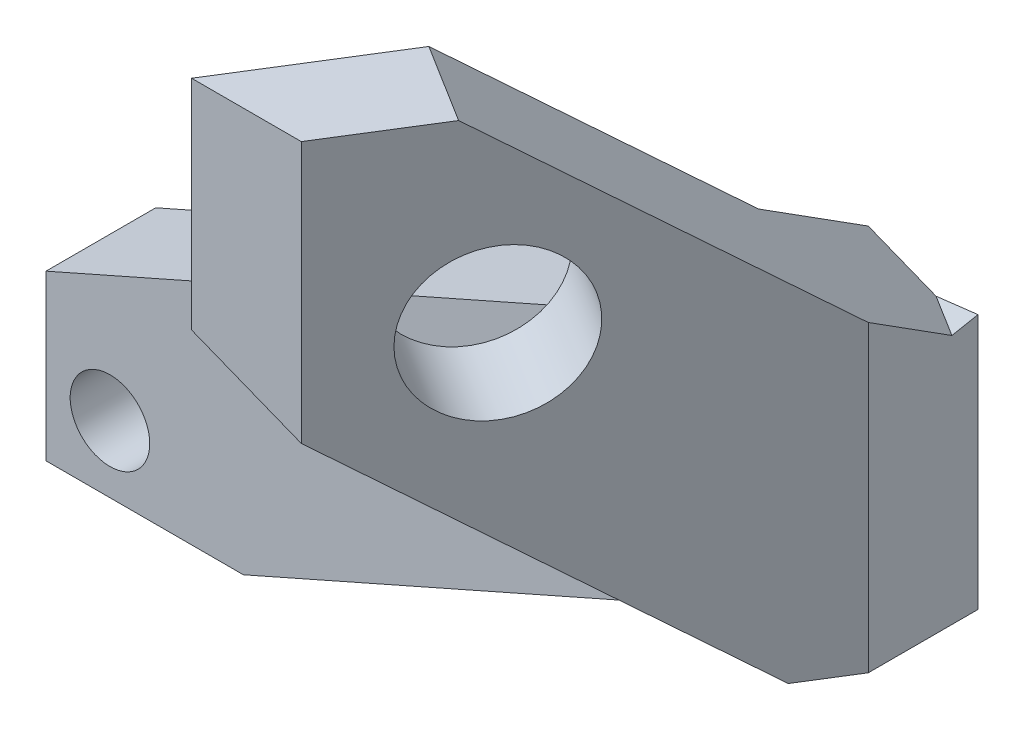
ISO-10303-21;
HEADER;
FILE_DESCRIPTION(('STEP AP214'),'2;1');
FILE_NAME('part.step','',(''),(''),'','','');
FILE_SCHEMA(('AUTOMOTIVE_DESIGN { 1 0 10303 214 1 1 1 1 }'));
ENDSEC;
DATA;
#1=APPLICATION_CONTEXT('core data for automotive mechanical design processes');
#2=APPLICATION_PROTOCOL_DEFINITION('international standard','automotive_design',2000,#1);
#3=PRODUCT_CONTEXT('',#1,'mechanical');
#4=PRODUCT('Part','Part','',(#3));
#5=PRODUCT_RELATED_PRODUCT_CATEGORY('part','',(#4));
#6=PRODUCT_DEFINITION_FORMATION('','',#4);
#7=PRODUCT_DEFINITION_CONTEXT('part definition',#1,'design');
#8=PRODUCT_DEFINITION('design','',#6,#7);
#9=PRODUCT_DEFINITION_SHAPE('','',#8);
#10=(LENGTH_UNIT() NAMED_UNIT(*) SI_UNIT(.MILLI.,.METRE.));
#11=(NAMED_UNIT(*) PLANE_ANGLE_UNIT() SI_UNIT($,.RADIAN.));
#12=(NAMED_UNIT(*) SI_UNIT($,.STERADIAN.) SOLID_ANGLE_UNIT());
#13=UNCERTAINTY_MEASURE_WITH_UNIT(LENGTH_MEASURE(1.E-05),#10,'distance_accuracy_value','');
#14=(GEOMETRIC_REPRESENTATION_CONTEXT(3) GLOBAL_UNCERTAINTY_ASSIGNED_CONTEXT((#13)) GLOBAL_UNIT_ASSIGNED_CONTEXT((#10,
#11,#12)) REPRESENTATION_CONTEXT('',''));
#15=CARTESIAN_POINT('',(0.,0.,0.));
#16=DIRECTION('',(0.,0.,1.));
#17=DIRECTION('',(1.,0.,0.));
#18=AXIS2_PLACEMENT_3D('',#15,#16,#17);
#19=CARTESIAN_POINT('',(0.,-9.50301267542342,4.));
#20=DIRECTION('',(0.,-1.,0.));
#21=DIRECTION('',(0.,0.,-1.));
#22=AXIS2_PLACEMENT_3D('',#19,#20,#21);
#23=PLANE('',#22);
#24=DIRECTION('',(-1.,0.,0.));
#25=VECTOR('',#24,1.);
#26=CARTESIAN_POINT('',(0.,-9.50301267542342,0.));
#27=LINE('',#26,#25);
#28=CARTESIAN_POINT('',(-7.77808473668179,-9.50301267542343,0.));
#29=VERTEX_POINT('',#28);
#30=CARTESIAN_POINT('',(-14.9718837863168,-9.50301267542342,0.));
#31=VERTEX_POINT('',#30);
#32=EDGE_CURVE('E191',#29,#31,#27,.T.);
#33=ORIENTED_EDGE('',*,*,#32,.F.);
#34=DIRECTION('',(0.,0.,-1.));
#35=VECTOR('',#34,1.);
#36=CARTESIAN_POINT('',(-7.77808473668179,-9.50301267542343,4.));
#37=LINE('',#36,#35);
#38=CARTESIAN_POINT('',(-7.77808473668179,-9.50301267542343,4.));
#39=VERTEX_POINT('',#38);
#40=EDGE_CURVE('E91',#39,#29,#37,.T.);
#41=ORIENTED_EDGE('',*,*,#40,.F.);
#42=DIRECTION('',(-1.,0.,0.));
#43=VECTOR('',#42,1.);
#44=CARTESIAN_POINT('',(0.,-9.50301267542342,4.));
#45=LINE('',#44,#43);
#46=CARTESIAN_POINT('',(-14.9718837863168,-9.50301267542342,4.));
#47=VERTEX_POINT('',#46);
#48=EDGE_CURVE('E182',#39,#47,#45,.T.);
#49=ORIENTED_EDGE('',*,*,#48,.T.);
#50=DIRECTION('',(0.,0.,-1.));
#51=VECTOR('',#50,1.);
#52=CARTESIAN_POINT('',(-14.9718837863168,-9.50301267542342,4.));
#53=LINE('',#52,#51);
#54=EDGE_CURVE('E86',#47,#31,#53,.T.);
#55=ORIENTED_EDGE('',*,*,#54,.T.);
#56=EDGE_LOOP('',(#33,#41,#49,#55));
#57=FACE_BOUND('',#56,.T.);
#58=ADVANCED_FACE('F35',(#57),#23,.T.);
#59=CARTESIAN_POINT('',(2.24247202608888,-5.0770739205045,4.));
#60=DIRECTION('',(0.40403025461446,-0.914745622212085,0.));
#61=DIRECTION('',(0.914745622212085,0.40403025461446,0.));
#62=AXIS2_PLACEMENT_3D('',#59,#60,#61);
#63=PLANE('',#62);
#64=DIRECTION('',(-0.914745622212085,-0.40403025461446,0.));
#65=VECTOR('',#64,1.);
#66=CARTESIAN_POINT('',(2.24247202608888,-5.0770739205045,0.));
#67=LINE('',#66,#65);
#68=CARTESIAN_POINT('',(11.,-1.20899718837863,0.));
#69=VERTEX_POINT('',#68);
#70=EDGE_CURVE('E194',#69,#29,#67,.T.);
#71=ORIENTED_EDGE('',*,*,#70,.F.);
#72=DIRECTION('',(0.,0.,-1.));
#73=VECTOR('',#72,1.);
#74=CARTESIAN_POINT('',(11.,-1.20899718837863,4.));
#75=LINE('',#74,#73);
#76=CARTESIAN_POINT('',(11.,-1.20899718837863,4.));
#77=VERTEX_POINT('',#76);
#78=EDGE_CURVE('E143',#77,#69,#75,.T.);
#79=ORIENTED_EDGE('',*,*,#78,.F.);
#80=DIRECTION('',(-0.914745622212085,-0.40403025461446,0.));
#81=VECTOR('',#80,1.);
#82=CARTESIAN_POINT('',(2.24247202608888,-5.0770739205045,4.));
#83=LINE('',#82,#81);
#84=EDGE_CURVE('E124',#77,#39,#83,.T.);
#85=ORIENTED_EDGE('',*,*,#84,.T.);
#86=ORIENTED_EDGE('',*,*,#40,.T.);
#87=EDGE_LOOP('',(#71,#79,#85,#86));
#88=FACE_BOUND('',#87,.T.);
#89=ADVANCED_FACE('F211',(#88),#63,.T.);
#90=CARTESIAN_POINT('',(0.,-1.20899718837863,4.));
#91=DIRECTION('',(0.,-1.,0.));
#92=DIRECTION('',(1.,0.,0.));
#93=AXIS2_PLACEMENT_3D('',#90,#91,#92);
#94=PLANE('',#93);
#95=DIRECTION('',(-0.84857451514723,0.,-0.529075885145641));
#96=VECTOR('',#95,1.);
#97=CARTESIAN_POINT('',(19.4857451514723,-1.20899718837863,9.29075885145641));
#98=LINE('',#97,#96);
#99=CARTESIAN_POINT('',(13.8803148310294,-1.20899718837863,5.79584125085422));
#100=VERTEX_POINT('',#99);
#101=EDGE_CURVE('E280',#100,#77,#98,.T.);
#102=ORIENTED_EDGE('',*,*,#101,.T.);
#103=ORIENTED_EDGE('',*,*,#78,.T.);
#104=DIRECTION('',(-1.,0.,0.));
#105=VECTOR('',#104,1.);
#106=CARTESIAN_POINT('',(0.,-1.20899718837863,0.));
#107=LINE('',#106,#105);
#108=CARTESIAN_POINT('',(15.,-1.20899718837863,0.));
#109=VERTEX_POINT('',#108);
#110=EDGE_CURVE('E197',#109,#69,#107,.T.);
#111=ORIENTED_EDGE('',*,*,#110,.F.);
#112=DIRECTION('',(0.,0.,-1.));
#113=VECTOR('',#112,1.);
#114=CARTESIAN_POINT('',(15.,-1.20899718837863,4.));
#115=LINE('',#114,#113);
#116=CARTESIAN_POINT('',(15.,-1.20899718837863,4.));
#117=VERTEX_POINT('',#116);
#118=EDGE_CURVE('E140',#117,#109,#115,.T.);
#119=ORIENTED_EDGE('',*,*,#118,.F.);
#120=DIRECTION('',(0.529075885145641,0.,-0.84857451514723));
#121=VECTOR('',#120,1.);
#122=CARTESIAN_POINT('',(7.06386172281539,-1.20899718837863,16.7286177272085));
#123=LINE('',#122,#121);
#124=EDGE_CURVE('E172',#100,#117,#123,.T.);
#125=ORIENTED_EDGE('',*,*,#124,.F.);
#126=EDGE_LOOP('',(#102,#103,#111,#119,#125));
#127=FACE_BOUND('',#126,.T.);
#128=ADVANCED_FACE('F215',(#127),#94,.T.);
#129=CARTESIAN_POINT('',(15.,0.,4.));
#130=DIRECTION('',(1.,0.,0.));
#131=DIRECTION('',(0.,0.,-1.));
#132=AXIS2_PLACEMENT_3D('',#129,#130,#131);
#133=PLANE('',#132);
#134=DIRECTION('',(0.,-0.535847848993314,-0.844314563850014));
#135=VECTOR('',#134,1.);
#136=CARTESIAN_POINT('',(15.,7.02223699385571,-0.45669274153051));
#137=LINE('',#136,#135);
#138=CARTESIAN_POINT('',(15.,9.85069610308111,4.));
#139=VERTEX_POINT('',#138);
#140=CARTESIAN_POINT('',(15.,7.91648803786603,0.952343763168437));
#141=VERTEX_POINT('',#140);
#142=EDGE_CURVE('E287',#139,#141,#137,.T.);
#143=ORIENTED_EDGE('',*,*,#142,.F.);
#144=DIRECTION('',(0.,-1.,0.));
#145=VECTOR('',#144,1.);
#146=CARTESIAN_POINT('',(15.,0.,4.));
#147=LINE('',#146,#145);
#148=EDGE_CURVE('E135',#139,#117,#147,.T.);
#149=ORIENTED_EDGE('',*,*,#148,.T.);
#150=ORIENTED_EDGE('',*,*,#118,.T.);
#151=DIRECTION('',(0.,-1.,0.));
#152=VECTOR('',#151,1.);
#153=CARTESIAN_POINT('',(15.,0.,0.));
#154=LINE('',#153,#152);
#155=CARTESIAN_POINT('',(15.,8.09893860230139,0.));
#156=VERTEX_POINT('',#155);
#157=EDGE_CURVE('E200',#156,#109,#154,.T.);
#158=ORIENTED_EDGE('',*,*,#157,.F.);
#159=DIRECTION('',(0.,0.188158684165593,-0.982138640708669));
#160=VECTOR('',#159,1.);
#161=CARTESIAN_POINT('',(15.,7.07301463002311,5.35505220007315));
#162=LINE('',#161,#160);
#163=EDGE_CURVE('E291',#141,#156,#162,.T.);
#164=ORIENTED_EDGE('',*,*,#163,.F.);
#165=EDGE_LOOP('',(#143,#149,#150,#158,#164));
#166=FACE_BOUND('',#165,.T.);
#167=ADVANCED_FACE('F221',(#166),#133,.T.);
#168=CARTESIAN_POINT('',(-1.14510097019524,2.59256847108256,4.));
#169=DIRECTION('',(0.40403025461446,-0.914745622212085,0.));
#170=DIRECTION('',(0.914745622212085,0.40403025461446,0.));
#171=AXIS2_PLACEMENT_3D('',#168,#169,#170);
#172=PLANE('',#171);
#173=DIRECTION('',(-0.914745622212085,-0.40403025461446,0.));
#174=VECTOR('',#173,1.);
#175=CARTESIAN_POINT('',(-1.14510097019524,2.59256847108256,0.));
#176=LINE('',#175,#174);
#177=CARTESIAN_POINT('',(11.,7.95688847235239,0.));
#178=VERTEX_POINT('',#177);
#179=CARTESIAN_POINT('',(-14.9718837863168,-3.514526710403,0.));
#180=VERTEX_POINT('',#179);
#181=EDGE_CURVE('E202',#178,#180,#176,.T.);
#182=ORIENTED_EDGE('',*,*,#181,.T.);
#183=DIRECTION('',(0.,0.,-1.));
#184=VECTOR('',#183,1.);
#185=CARTESIAN_POINT('',(-14.9718837863168,-3.514526710403,4.));
#186=LINE('',#185,#184);
#187=CARTESIAN_POINT('',(-14.9718837863168,-3.514526710403,4.));
#188=VERTEX_POINT('',#187);
#189=EDGE_CURVE('E134',#188,#180,#186,.T.);
#190=ORIENTED_EDGE('',*,*,#189,.F.);
#191=DIRECTION('',(-0.914745622212085,-0.40403025461446,0.));
#192=VECTOR('',#191,1.);
#193=CARTESIAN_POINT('',(-1.14510097019524,2.59256847108256,4.));
#194=LINE('',#193,#192);
#195=CARTESIAN_POINT('',(11.,7.95688847235239,4.));
#196=VERTEX_POINT('',#195);
#197=EDGE_CURVE('E121',#196,#188,#194,.T.);
#198=ORIENTED_EDGE('',*,*,#197,.F.);
#199=DIRECTION('',(0.,0.,-1.));
#200=VECTOR('',#199,1.);
#201=CARTESIAN_POINT('',(11.,7.95688847235239,4.));
#202=LINE('',#201,#200);
#203=EDGE_CURVE('E132',#196,#178,#202,.T.);
#204=ORIENTED_EDGE('',*,*,#203,.T.);
#205=EDGE_LOOP('',(#182,#190,#198,#204));
#206=FACE_BOUND('',#205,.T.);
#207=ADVANCED_FACE('F131',(#206),#172,.F.);
#208=CARTESIAN_POINT('',(-12.6409656817062,-7.06793585137644,4.));
#209=DIRECTION('',(0.,0.,-1.));
#210=DIRECTION('',(-1.,0.,0.));
#211=AXIS2_PLACEMENT_3D('',#208,#209,#210);
#212=CYLINDRICAL_SURFACE('',#211,1.45);
#213=CARTESIAN_POINT('',(-12.6409656817062,-7.06793585137644,4.));
#214=DIRECTION('',(0.,0.,1.));
#215=DIRECTION('',(1.,0.,0.));
#216=AXIS2_PLACEMENT_3D('',#213,#214,#215);
#217=CIRCLE('',#216,1.45);
#218=CARTESIAN_POINT('',(-11.1909656817062,-7.06793585137644,4.));
#219=VERTEX_POINT('',#218);
#220=EDGE_CURVE('E179',#219,#219,#217,.T.);
#221=ORIENTED_EDGE('',*,*,#220,.T.);
#222=EDGE_LOOP('',(#221));
#223=FACE_BOUND('',#222,.T.);
#224=CARTESIAN_POINT('',(-12.6409656817062,-7.06793585137644,0.));
#225=DIRECTION('',(0.,0.,1.));
#226=DIRECTION('',(1.,0.,0.));
#227=AXIS2_PLACEMENT_3D('',#224,#225,#226);
#228=CIRCLE('',#227,1.45);
#229=CARTESIAN_POINT('',(-11.1909656817062,-7.06793585137644,0.));
#230=VERTEX_POINT('',#229);
#231=EDGE_CURVE('E174',#230,#230,#228,.T.);
#232=ORIENTED_EDGE('',*,*,#231,.F.);
#233=EDGE_LOOP('',(#232));
#234=FACE_BOUND('',#233,.T.);
#235=ADVANCED_FACE('F37',(#223,#234),#212,.F.);
#236=CARTESIAN_POINT('',(-14.9718837863168,0.,4.));
#237=DIRECTION('',(1.,0.,0.));
#238=DIRECTION('',(0.,1.,0.));
#239=AXIS2_PLACEMENT_3D('',#236,#237,#238);
#240=PLANE('',#239);
#241=DIRECTION('',(0.,-1.,0.));
#242=VECTOR('',#241,1.);
#243=CARTESIAN_POINT('',(-14.9718837863168,0.,0.));
#244=LINE('',#243,#242);
#245=EDGE_CURVE('E183',#180,#31,#244,.T.);
#246=ORIENTED_EDGE('',*,*,#245,.T.);
#247=ORIENTED_EDGE('',*,*,#54,.F.);
#248=DIRECTION('',(0.,-1.,0.));
#249=VECTOR('',#248,1.);
#250=CARTESIAN_POINT('',(-14.9718837863168,0.,4.));
#251=LINE('',#250,#249);
#252=EDGE_CURVE('E59',#188,#47,#251,.T.);
#253=ORIENTED_EDGE('',*,*,#252,.F.);
#254=ORIENTED_EDGE('',*,*,#189,.T.);
#255=EDGE_LOOP('',(#246,#247,#253,#254));
#256=FACE_BOUND('',#255,.T.);
#257=ADVANCED_FACE('F205',(#256),#240,.F.);
#258=CARTESIAN_POINT('',(0.,0.,4.));
#259=DIRECTION('',(0.,0.,1.));
#260=DIRECTION('',(1.,0.,0.));
#261=AXIS2_PLACEMENT_3D('',#258,#259,#260);
#262=PLANE('',#261);
#263=DIRECTION('',(0.,-1.,0.));
#264=VECTOR('',#263,1.);
#265=CARTESIAN_POINT('',(11.,-1.20899718837863,4.));
#266=LINE('',#265,#264);
#267=EDGE_CURVE('E106',#196,#77,#266,.T.);
#268=ORIENTED_EDGE('',*,*,#267,.F.);
#269=ORIENTED_EDGE('',*,*,#197,.T.);
#270=ORIENTED_EDGE('',*,*,#252,.T.);
#271=ORIENTED_EDGE('',*,*,#48,.F.);
#272=ORIENTED_EDGE('',*,*,#84,.F.);
#273=EDGE_LOOP('',(#268,#269,#270,#271,#272));
#274=FACE_BOUND('',#273,.T.);
#275=ORIENTED_EDGE('',*,*,#220,.F.);
#276=EDGE_LOOP('',(#275));
#277=FACE_BOUND('',#276,.T.);
#278=ADVANCED_FACE('F119',(#274,#277),#262,.T.);
#279=CARTESIAN_POINT('',(0.,0.,0.));
#280=DIRECTION('',(0.,0.,1.));
#281=DIRECTION('',(1.,0.,0.));
#282=AXIS2_PLACEMENT_3D('',#279,#280,#281);
#283=PLANE('',#282);
#284=ORIENTED_EDGE('',*,*,#231,.T.);
#285=EDGE_LOOP('',(#284));
#286=FACE_BOUND('',#285,.T.);
#287=DIRECTION('',(0.92984928283394,-0.367940635447089,0.));
#288=VECTOR('',#287,1.);
#289=CARTESIAN_POINT('',(4.53238139967688,11.4541075054089,0.));
#290=LINE('',#289,#288);
#291=CARTESIAN_POINT('',(11.,8.89487587339692,0.));
#292=VERTEX_POINT('',#291);
#293=CARTESIAN_POINT('',(13.4725543730618,7.91648803786603,0.));
#294=VERTEX_POINT('',#293);
#295=EDGE_CURVE('E274',#292,#294,#290,.T.);
#296=ORIENTED_EDGE('',*,*,#295,.T.);
#297=DIRECTION('',(0.992941511922272,0.1186050332048,0.));
#298=VECTOR('',#297,1.);
#299=CARTESIAN_POINT('',(-0.742787366975617,6.21849167166445,0.));
#300=LINE('',#299,#298);
#301=EDGE_CURVE('E11',#294,#156,#300,.T.);
#302=ORIENTED_EDGE('',*,*,#301,.T.);
#303=ORIENTED_EDGE('',*,*,#157,.T.);
#304=ORIENTED_EDGE('',*,*,#110,.T.);
#305=ORIENTED_EDGE('',*,*,#70,.T.);
#306=ORIENTED_EDGE('',*,*,#32,.T.);
#307=ORIENTED_EDGE('',*,*,#245,.F.);
#308=ORIENTED_EDGE('',*,*,#181,.F.);
#309=DIRECTION('',(0.,-1.,0.));
#310=VECTOR('',#309,1.);
#311=CARTESIAN_POINT('',(11.,17.9568884723524,0.));
#312=LINE('',#311,#310);
#313=EDGE_CURVE('E114',#292,#178,#312,.T.);
#314=ORIENTED_EDGE('',*,*,#313,.F.);
#315=EDGE_LOOP('',(#296,#302,#303,#304,#305,#306,#307,#308,#314));
#316=FACE_BOUND('',#315,.T.);
#317=ADVANCED_FACE('F208',(#286,#316),#283,.F.);
#318=CARTESIAN_POINT('',(7.06386172281539,-1.20899718837863,16.7286177272085));
#319=DIRECTION('',(-0.84857451514723,0.,-0.529075885145641));
#320=DIRECTION('',(-0.529075885145641,0.,0.84857451514723));
#321=AXIS2_PLACEMENT_3D('',#318,#319,#320);
#322=PLANE('',#321);
#323=CARTESIAN_POINT('',(9.81517697859498,11.0905963626529,12.3158367354086));
#324=DIRECTION('',(-0.84857451514723,0.,-0.529075885145641));
#325=DIRECTION('',(-0.529075885145641,0.,0.84857451514723));
#326=AXIS2_PLACEMENT_3D('',#323,#324,#325);
#327=CIRCLE('',#326,2.75);
#328=CARTESIAN_POINT('',(8.36021829444446,11.0905963626529,14.6494166520635));
#329=VERTEX_POINT('',#328);
#330=EDGE_CURVE('E271',#329,#329,#327,.T.);
#331=ORIENTED_EDGE('',*,*,#330,.T.);
#332=EDGE_LOOP('',(#331));
#333=FACE_BOUND('',#332,.T.);
#334=DIRECTION('',(0.,1.,0.));
#335=VECTOR('',#334,1.);
#336=CARTESIAN_POINT('',(7.06386172281539,-1.20899718837863,16.7286177272085));
#337=LINE('',#336,#335);
#338=CARTESIAN_POINT('',(7.06386172281539,8.42680133520222,16.7286177272085));
#339=VERTEX_POINT('',#338);
#340=CARTESIAN_POINT('',(7.06386172281539,17.9568884723524,16.7286177272085));
#341=VERTEX_POINT('',#340);
#342=EDGE_CURVE('E126',#339,#341,#337,.T.);
#343=ORIENTED_EDGE('',*,*,#342,.F.);
#344=DIRECTION('',(0.42368610953805,-0.598926439298594,-0.679541905178495));
#345=VECTOR('',#344,1.);
#346=CARTESIAN_POINT('',(9.50901124654078,4.97031629868729,12.8068899943586));
#347=LINE('',#346,#345);
#348=EDGE_CURVE('E50',#339,#100,#347,.T.);
#349=ORIENTED_EDGE('',*,*,#348,.T.);
#350=ORIENTED_EDGE('',*,*,#124,.T.);
#351=ORIENTED_EDGE('',*,*,#148,.F.);
#352=DIRECTION('',(-0.42368610953805,0.598926439298594,0.679541905178495));
#353=VECTOR('',#352,1.);
#354=CARTESIAN_POINT('',(12.7171292598706,13.0777824129331,7.66145195016002));
#355=LINE('',#354,#353);
#356=CARTESIAN_POINT('',(9.26560445031326,17.9568884723524,13.1972854175698));
#357=VERTEX_POINT('',#356);
#358=EDGE_CURVE('E282',#139,#357,#355,.T.);
#359=ORIENTED_EDGE('',*,*,#358,.T.);
#360=DIRECTION('',(0.529075885145641,0.,-0.84857451514723));
#361=VECTOR('',#360,1.);
#362=CARTESIAN_POINT('',(7.06386172281539,17.9568884723524,16.7286177272085));
#363=LINE('',#362,#361);
#364=EDGE_CURVE('E115',#341,#357,#363,.T.);
#365=ORIENTED_EDGE('',*,*,#364,.F.);
#366=EDGE_LOOP('',(#343,#349,#350,#351,#359,#365));
#367=FACE_BOUND('',#366,.T.);
#368=ADVANCED_FACE('F232',(#333,#367),#322,.F.);
#369=CARTESIAN_POINT('',(3.06386172281539,-1.20899718837863,16.7286177272085));
#370=DIRECTION('',(0.84857451514723,0.,0.529075885145641));
#371=DIRECTION('',(0.529075885145641,0.,-0.84857451514723));
#372=AXIS2_PLACEMENT_3D('',#369,#370,#371);
#373=PLANE('',#372);
#374=CARTESIAN_POINT('',(6.93486214756555,11.0905963626529,10.5199954845544));
#375=DIRECTION('',(-0.84857451514723,0.,-0.529075885145641));
#376=DIRECTION('',(-0.529075885145641,0.,0.84857451514723));
#377=AXIS2_PLACEMENT_3D('',#374,#375,#376);
#378=CIRCLE('',#377,2.75);
#379=CARTESIAN_POINT('',(5.47990346341504,11.0905963626529,12.8535754012093));
#380=VERTEX_POINT('',#379);
#381=EDGE_CURVE('E268',#380,#380,#378,.T.);
#382=ORIENTED_EDGE('',*,*,#381,.F.);
#383=EDGE_LOOP('',(#382));
#384=FACE_BOUND('',#383,.T.);
#385=ORIENTED_EDGE('',*,*,#267,.T.);
#386=DIRECTION('',(0.423686109538051,-0.598926439298594,-0.679541905178495));
#387=VECTOR('',#386,1.);
#388=CARTESIAN_POINT('',(11.,-1.20899718837863,4.));
#389=LINE('',#388,#387);
#390=CARTESIAN_POINT('',(3.06386172281539,10.0095982131036,16.7286177272085));
#391=VERTEX_POINT('',#390);
#392=EDGE_CURVE('E155',#391,#77,#389,.T.);
#393=ORIENTED_EDGE('',*,*,#392,.F.);
#394=DIRECTION('',(0.,-1.,0.));
#395=VECTOR('',#394,1.);
#396=CARTESIAN_POINT('',(3.06386172281539,-1.20899718837863,16.7286177272085));
#397=LINE('',#396,#395);
#398=CARTESIAN_POINT('',(3.06386172281539,17.9568884723524,16.7286177272085));
#399=VERTEX_POINT('',#398);
#400=EDGE_CURVE('E165',#399,#391,#397,.T.);
#401=ORIENTED_EDGE('',*,*,#400,.F.);
#402=DIRECTION('',(-0.529075885145641,0.,0.84857451514723));
#403=VECTOR('',#402,1.);
#404=CARTESIAN_POINT('',(11.,17.9568884723524,4.));
#405=LINE('',#404,#403);
#406=CARTESIAN_POINT('',(6.38528961928384,17.9568884723524,11.4014441667156));
#407=VERTEX_POINT('',#406);
#408=EDGE_CURVE('E294',#407,#399,#405,.T.);
#409=ORIENTED_EDGE('',*,*,#408,.F.);
#410=DIRECTION('',(-0.42368610953805,0.598926439298594,0.679541905178495));
#411=VECTOR('',#410,1.);
#412=CARTESIAN_POINT('',(6.38528961928384,17.9568884723524,11.4014441667156));
#413=LINE('',#412,#411);
#414=CARTESIAN_POINT('',(11.,11.4334929809824,4.00000000000001));
#415=VERTEX_POINT('',#414);
#416=EDGE_CURVE('E110',#415,#407,#413,.T.);
#417=ORIENTED_EDGE('',*,*,#416,.F.);
#418=DIRECTION('',(0.,-1.,0.));
#419=VECTOR('',#418,1.);
#420=CARTESIAN_POINT('',(11.,17.9568884723524,4.));
#421=LINE('',#420,#419);
#422=EDGE_CURVE('E101',#415,#196,#421,.T.);
#423=ORIENTED_EDGE('',*,*,#422,.T.);
#424=EDGE_LOOP('',(#385,#393,#401,#409,#417,#423));
#425=FACE_BOUND('',#424,.T.);
#426=ADVANCED_FACE('F103',(#384,#425),#373,.F.);
#427=CARTESIAN_POINT('',(-7.93613827718461,0.,16.7286177272085));
#428=DIRECTION('',(0.,0.,1.));
#429=DIRECTION('',(1.,0.,0.));
#430=AXIS2_PLACEMENT_3D('',#427,#428,#429);
#431=PLANE('',#430);
#432=DIRECTION('',(-0.92984928283394,0.367940635447089,0.));
#433=VECTOR('',#432,1.);
#434=CARTESIAN_POINT('',(-3.02237766360406,12.4179183878498,16.7286177272085));
#435=LINE('',#434,#433);
#436=EDGE_CURVE('E43',#339,#391,#435,.T.);
#437=ORIENTED_EDGE('',*,*,#436,.F.);
#438=ORIENTED_EDGE('',*,*,#342,.T.);
#439=DIRECTION('',(1.,0.,0.));
#440=VECTOR('',#439,1.);
#441=CARTESIAN_POINT('',(3.06386172281539,17.9568884723524,16.7286177272085));
#442=LINE('',#441,#440);
#443=EDGE_CURVE('E171',#399,#341,#442,.T.);
#444=ORIENTED_EDGE('',*,*,#443,.F.);
#445=ORIENTED_EDGE('',*,*,#400,.T.);
#446=EDGE_LOOP('',(#437,#438,#444,#445));
#447=FACE_BOUND('',#446,.T.);
#448=ADVANCED_FACE('F169',(#447),#431,.T.);
#449=CARTESIAN_POINT('',(11.,17.9568884723524,0.));
#450=DIRECTION('',(1.,0.,0.));
#451=DIRECTION('',(0.,0.,-1.));
#452=AXIS2_PLACEMENT_3D('',#449,#450,#451);
#453=PLANE('',#452);
#454=ORIENTED_EDGE('',*,*,#422,.F.);
#455=DIRECTION('',(0.,-0.535847848993313,-0.844314563850014));
#456=VECTOR('',#455,1.);
#457=CARTESIAN_POINT('',(11.,11.4968779872794,4.09987328314704));
#458=LINE('',#457,#456);
#459=EDGE_CURVE('E272',#415,#292,#458,.T.);
#460=ORIENTED_EDGE('',*,*,#459,.T.);
#461=ORIENTED_EDGE('',*,*,#313,.T.);
#462=ORIENTED_EDGE('',*,*,#203,.F.);
#463=EDGE_LOOP('',(#454,#460,#461,#462));
#464=FACE_BOUND('',#463,.T.);
#465=ADVANCED_FACE('F137',(#464),#453,.F.);
#466=CARTESIAN_POINT('',(0.,17.9568884723524,0.));
#467=DIRECTION('',(0.,1.,0.));
#468=DIRECTION('',(0.,0.,1.));
#469=AXIS2_PLACEMENT_3D('',#466,#467,#468);
#470=PLANE('',#469);
#471=DIRECTION('',(0.84857451514723,0.,0.529075885145641));
#472=VECTOR('',#471,1.);
#473=CARTESIAN_POINT('',(-3.3314174169013,17.9568884723524,5.34319555789596));
#474=LINE('',#473,#472);
#475=EDGE_CURVE('E150',#407,#357,#474,.T.);
#476=ORIENTED_EDGE('',*,*,#475,.F.);
#477=ORIENTED_EDGE('',*,*,#408,.T.);
#478=ORIENTED_EDGE('',*,*,#443,.T.);
#479=ORIENTED_EDGE('',*,*,#364,.T.);
#480=EDGE_LOOP('',(#476,#477,#478,#479));
#481=FACE_BOUND('',#480,.T.);
#482=ADVANCED_FACE('F246',(#481),#470,.T.);
#483=CARTESIAN_POINT('',(14.8710347707561,17.9568884723524,16.692203018172));
#484=DIRECTION('',(-0.316877536009031,-0.800804046136823,0.508233712836661));
#485=DIRECTION('',(0.,-0.535847848993314,-0.844314563850014));
#486=AXIS2_PLACEMENT_3D('',#483,#484,#485);
#487=PLANE('',#486);
#488=ORIENTED_EDGE('',*,*,#142,.T.);
#489=DIRECTION('',(-0.84857451514723,0.,-0.529075885145641));
#490=VECTOR('',#489,1.);
#491=CARTESIAN_POINT('',(21.9737070175742,7.91648803786603,5.30036523589587));
#492=LINE('',#491,#490);
#493=EDGE_CURVE('E167',#141,#294,#492,.T.);
#494=ORIENTED_EDGE('',*,*,#493,.T.);
#495=ORIENTED_EDGE('',*,*,#295,.F.);
#496=ORIENTED_EDGE('',*,*,#459,.F.);
#497=ORIENTED_EDGE('',*,*,#416,.T.);
#498=ORIENTED_EDGE('',*,*,#475,.T.);
#499=ORIENTED_EDGE('',*,*,#358,.F.);
#500=EDGE_LOOP('',(#488,#494,#495,#496,#497,#498,#499));
#501=FACE_BOUND('',#500,.T.);
#502=ADVANCED_FACE('F249',(#501),#487,.F.);
#503=CARTESIAN_POINT('',(21.9737070175742,7.91648803786603,5.30036523589587));
#504=DIRECTION('',(0.116515603790587,-0.975449158136398,-0.186877109257147));
#505=DIRECTION('',(0.,0.188158684165593,-0.982138640708669));
#506=AXIS2_PLACEMENT_3D('',#503,#504,#505);
#507=PLANE('',#506);
#508=ORIENTED_EDGE('',*,*,#163,.T.);
#509=ORIENTED_EDGE('',*,*,#301,.F.);
#510=ORIENTED_EDGE('',*,*,#493,.F.);
#511=EDGE_LOOP('',(#508,#509,#510));
#512=FACE_BOUND('',#511,.T.);
#513=ADVANCED_FACE('F251',(#512),#507,.F.);
#514=CARTESIAN_POINT('',(19.4857451514723,-1.20899718837863,9.29075885145641));
#515=DIRECTION('',(0.31687753600903,0.800804046136824,-0.508233712836661));
#516=DIRECTION('',(0.,0.535847848993313,0.844314563850014));
#517=AXIS2_PLACEMENT_3D('',#514,#515,#516);
#518=PLANE('',#517);
#519=ORIENTED_EDGE('',*,*,#436,.T.);
#520=ORIENTED_EDGE('',*,*,#392,.T.);
#521=ORIENTED_EDGE('',*,*,#101,.F.);
#522=ORIENTED_EDGE('',*,*,#348,.F.);
#523=EDGE_LOOP('',(#519,#520,#521,#522));
#524=FACE_BOUND('',#523,.T.);
#525=ADVANCED_FACE('F154',(#524),#518,.F.);
#526=CARTESIAN_POINT('',(15.4206072990379,11.0905963626529,15.8107543360108));
#527=DIRECTION('',(-0.84857451514723,0.,-0.529075885145641));
#528=DIRECTION('',(-0.529075885145641,0.,0.84857451514723));
#529=AXIS2_PLACEMENT_3D('',#526,#527,#528);
#530=CYLINDRICAL_SURFACE('',#529,2.75);
#531=ORIENTED_EDGE('',*,*,#381,.T.);
#532=EDGE_LOOP('',(#531));
#533=FACE_BOUND('',#532,.T.);
#534=ORIENTED_EDGE('',*,*,#330,.F.);
#535=EDGE_LOOP('',(#534));
#536=FACE_BOUND('',#535,.T.);
#537=ADVANCED_FACE('F260',(#533,#536),#530,.F.);
#538=CLOSED_SHELL('',(#58,#89,#128,#167,#207,#235,#257,#278,#317,#368,#426,#448,#465,#482,#502,
#513,#525,#537));
#539=MANIFOLD_SOLID_BREP('B2',#538);
#540=ADVANCED_BREP_SHAPE_REPRESENTATION('',(#18,#539),#14);
#541=SHAPE_DEFINITION_REPRESENTATION(#9,#540);
ENDSEC;
END-ISO-10303-21;
